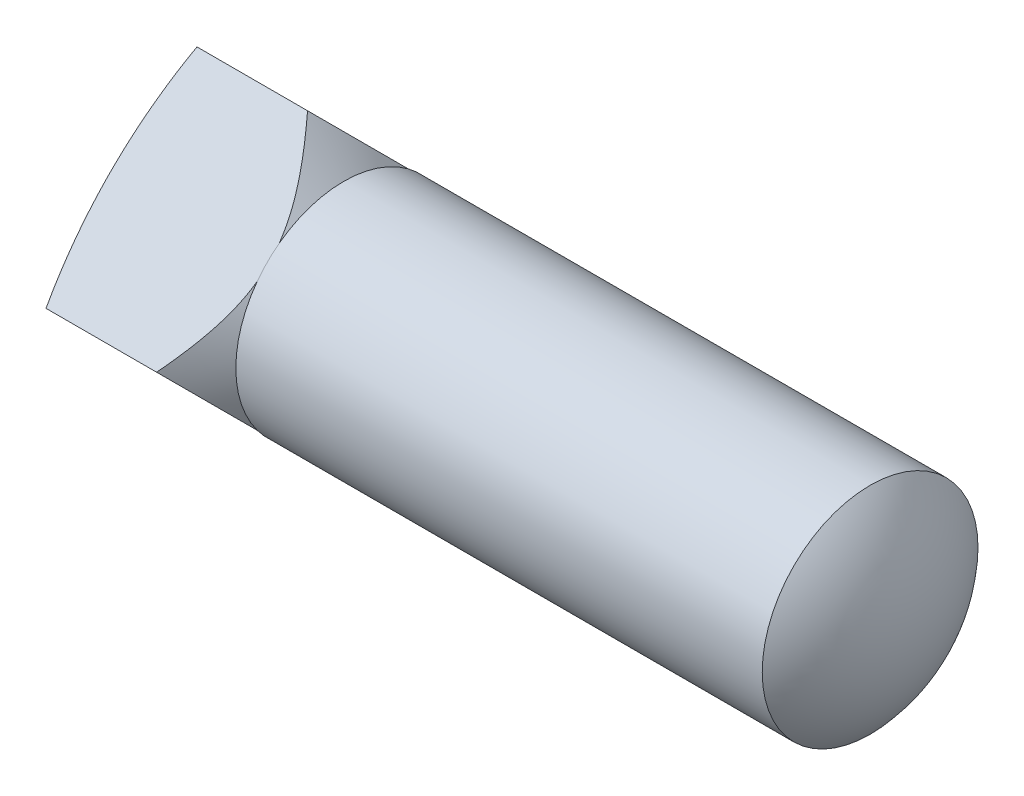
ISO-10303-21;
HEADER;
FILE_DESCRIPTION(('STEP AP214'),'2;1');
FILE_NAME('part.step','',(''),(''),'','','');
FILE_SCHEMA(('AUTOMOTIVE_DESIGN { 1 0 10303 214 1 1 1 1 }'));
ENDSEC;
DATA;
#1=APPLICATION_CONTEXT('core data for automotive mechanical design processes');
#2=APPLICATION_PROTOCOL_DEFINITION('international standard','automotive_design',2000,#1);
#3=PRODUCT_CONTEXT('',#1,'mechanical');
#4=PRODUCT('Part','Part','',(#3));
#5=PRODUCT_RELATED_PRODUCT_CATEGORY('part','',(#4));
#6=PRODUCT_DEFINITION_FORMATION('','',#4);
#7=PRODUCT_DEFINITION_CONTEXT('part definition',#1,'design');
#8=PRODUCT_DEFINITION('design','',#6,#7);
#9=PRODUCT_DEFINITION_SHAPE('','',#8);
#10=(LENGTH_UNIT() NAMED_UNIT(*) SI_UNIT(.MILLI.,.METRE.));
#11=(NAMED_UNIT(*) PLANE_ANGLE_UNIT() SI_UNIT($,.RADIAN.));
#12=(NAMED_UNIT(*) SI_UNIT($,.STERADIAN.) SOLID_ANGLE_UNIT());
#13=UNCERTAINTY_MEASURE_WITH_UNIT(LENGTH_MEASURE(1.E-05),#10,'distance_accuracy_value','');
#14=(GEOMETRIC_REPRESENTATION_CONTEXT(3) GLOBAL_UNCERTAINTY_ASSIGNED_CONTEXT((#13)) GLOBAL_UNIT_ASSIGNED_CONTEXT((#10,
#11,#12)) REPRESENTATION_CONTEXT('',''));
#15=CARTESIAN_POINT('',(0.,0.,0.));
#16=DIRECTION('',(0.,0.,1.));
#17=DIRECTION('',(1.,0.,0.));
#18=AXIS2_PLACEMENT_3D('',#15,#16,#17);
#19=CARTESIAN_POINT('',(-3.7592,0.,-3.376576301522));
#20=DIRECTION('',(0.,-0.707106781186549,0.707106781186546));
#21=DIRECTION('',(0.,-0.707106781186546,-0.707106781186549));
#22=AXIS2_PLACEMENT_3D('',#19,#20,#21);
#23=PLANE('',#22);
#24=CARTESIAN_POINT('',(-3.71463670391965,-2.84404188134766,-6.22061818286968));
#25=CARTESIAN_POINT('',(-3.55613835738031,-2.70146848632889,-6.07804478785091));
#26=CARTESIAN_POINT('',(-3.3981461725614,-2.55860959219922,-5.93518589372124));
#27=CARTESIAN_POINT('',(-3.08363247371533,-2.27203984223067,-5.64861614375269));
#28=CARTESIAN_POINT('',(-2.92711125800507,-2.12832882282157,-5.50490512434359));
#29=CARTESIAN_POINT('',(-2.61537743727245,-1.83919610910249,-5.2157724106245));
#30=CARTESIAN_POINT('',(-2.46017361078745,-1.69376967166462,-5.07034597318663));
#31=CARTESIAN_POINT('',(-2.15261018150916,-1.40143979481067,-4.77801609633269));
#32=CARTESIAN_POINT('',(-2.00025026783184,-1.25453651956937,-4.63111282109139));
#33=CARTESIAN_POINT('',(-1.72970912218957,-0.988182083810127,-4.36475838533214));
#34=CARTESIAN_POINT('',(-1.61078189630441,-0.869111186157922,-4.24568748767993));
#35=CARTESIAN_POINT('',(-1.37665028006823,-0.62910522635227,-4.00568152787428));
#36=CARTESIAN_POINT('',(-1.2614467785999,-0.508169729132244,-3.88474603065425));
#37=CARTESIAN_POINT('',(-1.03648369877529,-0.263755950580118,-3.64033225210213));
#38=CARTESIAN_POINT('',(-0.926724208648683,-0.140277628082979,-3.51685392960499));
#39=CARTESIAN_POINT('',(-0.7684117717571,0.0475823268502081,-3.3289939746718));
#40=CARTESIAN_POINT('',(-0.716703508322023,0.110632006865484,-3.26594429465652));
#41=CARTESIAN_POINT('',(-0.615958235242701,0.237786165781796,-3.13879013574021));
#42=CARTESIAN_POINT('',(-0.566920935267898,0.301890529049742,-3.07468577247226));
#43=CARTESIAN_POINT('',(-0.470564396194469,0.433616769365341,-2.94295953215667));
#44=CARTESIAN_POINT('',(-0.423365899696171,0.501283129317179,-2.87529317220483));
#45=CARTESIAN_POINT('',(-0.333664681644452,0.638144262361105,-2.7384320391609));
#46=CARTESIAN_POINT('',(-0.291160483356162,0.707338546531595,-2.66923775499041));
#47=CARTESIAN_POINT('',(-0.212295032056012,0.847303910790571,-2.52927239073143));
#48=CARTESIAN_POINT('',(-0.175920709426423,0.918071262430303,-2.4585050390917));
#49=CARTESIAN_POINT('',(-0.110910569940003,1.06137320930862,-2.31520309221338));
#50=CARTESIAN_POINT('',(-0.0822720790273512,1.13390718439999,-2.24266911712201));
#51=CARTESIAN_POINT('',(-0.0393755590361013,1.26582470943115,-2.11075159209085));
#52=CARTESIAN_POINT('',(-0.0233846612610307,1.32492428039639,-2.05165202112561));
#53=CARTESIAN_POINT('',(0.00161538214945569,1.44386018912425,-1.93271611239775));
#54=CARTESIAN_POINT('',(0.01062589901696,1.50369637983728,-1.87287992168473));
#55=CARTESIAN_POINT('',(0.0210920652181379,1.62355655088551,-1.75301975063649));
#56=CARTESIAN_POINT('',(0.0225662852538811,1.68357970456735,-1.69299659695465));
#57=CARTESIAN_POINT('',(0.0179155629650282,1.80348109631526,-1.57309520520674));
#58=CARTESIAN_POINT('',(0.0117896392073207,1.8633593146648,-1.5132169868572));
#59=CARTESIAN_POINT('',(-0.0100815229762265,1.99721927704997,-1.37935702447203));
#60=CARTESIAN_POINT('',(-0.0278264770273191,2.0710373829424,-1.30553891857961));
#61=CARTESIAN_POINT('',(-0.0730208692286259,2.21718932171447,-1.15938697980753));
#62=CARTESIAN_POINT('',(-0.100477023648008,2.28952209061008,-1.08705421091192));
#63=CARTESIAN_POINT('',(-0.147658550765414,2.39694211918634,-0.97963418233566));
#64=CARTESIAN_POINT('',(-0.16445563406514,2.43269379192944,-0.943882509592556));
#65=CARTESIAN_POINT('',(-0.199813441042721,2.50374093804668,-0.872835363475323));
#66=CARTESIAN_POINT('',(-0.218373328077732,2.53903661889179,-0.837539682630207));
#67=CARTESIAN_POINT('',(-0.257053416617413,2.60919264030522,-0.767383661216781));
#68=CARTESIAN_POINT('',(-0.277173505655789,2.64405301204261,-0.732523289479391));
#69=CARTESIAN_POINT('',(-0.31879132084626,2.71336326090943,-0.663213040612568));
#70=CARTESIAN_POINT('',(-0.340289202341565,2.74781309123004,-0.628763210291955));
#71=CARTESIAN_POINT('',(-0.403215402660207,2.84534321177681,-0.531233089745182));
#72=CARTESIAN_POINT('',(-0.446099723650983,2.90795472792716,-0.468621573594832));
#73=CARTESIAN_POINT('',(-0.535121543723193,3.03201522266659,-0.34456107885541));
#74=CARTESIAN_POINT('',(-0.581259746295166,3.09346394619475,-0.283112355327244));
#75=CARTESIAN_POINT('',(-0.723571645103508,3.27639274740933,-0.100183554112664));
#76=CARTESIAN_POINT('',(-0.823588743807215,3.39637526634609,0.0197989648240903));
#77=CARTESIAN_POINT('',(-1.03047356134524,3.63375592705894,0.257179625536947));
#78=CARTESIAN_POINT('',(-1.13735948771655,3.75114599014638,0.374569688624388));
#79=CARTESIAN_POINT('',(-1.3555789667849,3.98376603551817,0.607189733996177));
#80=CARTESIAN_POINT('',(-1.46691077768577,4.09899683825343,0.722420536731433));
#81=CARTESIAN_POINT('',(-1.69305612145303,4.32823502699326,0.951658725471272));
#82=CARTESIAN_POINT('',(-1.80787896298807,4.44223779677305,1.06566149525106));
#83=CARTESIAN_POINT('',(-2.03983717113577,4.66907271742692,1.29249641590493));
#84=CARTESIAN_POINT('',(-2.15697273510535,4.78190476713294,1.40532846561095));
#85=CARTESIAN_POINT('',(-2.39279712471293,5.00650286499344,1.62992656347145));
#86=CARTESIAN_POINT('',(-2.51148349733177,5.11827020377584,1.74169390225385));
#87=CARTESIAN_POINT('',(-2.75017246375149,5.34109999204903,1.96452369052705));
#88=CARTESIAN_POINT('',(-2.87017506440563,5.45216243786488,2.0755861363429));
#89=CARTESIAN_POINT('',(-3.05068333501773,5.61808795816654,2.24151165664455));
#90=CARTESIAN_POINT('',(-3.11080136898787,5.67316227631999,2.29658597479801));
#91=CARTESIAN_POINT('',(-3.23127854688798,5.78319708269407,2.40662078117208));
#92=CARTESIAN_POINT('',(-3.2916377379528,5.83815754511762,2.46158124359564));
#93=CARTESIAN_POINT('',(-3.41233885436045,5.94776482135316,2.57118851983118));
#94=CARTESIAN_POINT('',(-3.47268003281206,6.00241204656933,2.62583574504735));
#95=CARTESIAN_POINT('',(-3.59353260813615,6.11159399323991,2.73501769171792));
#96=CARTESIAN_POINT('',(-3.65404396700813,6.1661287357237,2.78955243420172));
#97=CARTESIAN_POINT('',(-3.71463670391965,6.22061818286967,2.84404188134768));
#98=B_SPLINE_CURVE_WITH_KNOTS('',3,(#24,#25,#26,#27,#28,#29,#30,#31,#32,#33,#34,#35,#36,#37,#38,
#39,#40,#41,#42,#43,#44,#45,#46,#47,#48,#49,#50,#51,#52,#53,#54,#55,#56,#57,#58,#59,#60,#61,#62,
#63,#64,#65,#66,#67,#68,#69,#70,#71,#72,#73,#74,#75,#76,#77,#78,#79,#80,#81,#82,#83,#84,#85,#86,
#87,#88,#89,#90,#91,#92,#93,#94,#95,#96,#97),.UNSPECIFIED.,.F.,.F.,(4,2,2,2,2,2,2,2,2,2,2,2,2,2,
2,2,2,2,2,2,2,2,2,2,2,2,2,2,2,2,2,2,2,2,2,2,4),(0.,0.769411594985046,1.53897600020602,
2.31192373762504,3.0847864790189,3.70321119591574,4.32178246157397,4.94036374898193,
5.24955145783677,5.55870549100782,5.87871228162844,6.19861811586591,6.51783299840492,
6.8369373958692,7.09196626841739,7.34694503015989,7.60129517747025,7.85567817332239,
8.17279662746613,8.49013483105983,8.64994152137469,8.80967274140047,8.9693924579743,
9.12913021439975,9.42418817492742,9.71931012383279,10.3099299987715,10.9021857726157,
11.4942117478058,12.0879855523367,12.6818102476393,13.2747881880488,13.8677692174056,
14.1629380958073,14.4581678026877,14.7523159011579,15.0464028402099),.UNSPECIFIED.);
#99=CARTESIAN_POINT('',(-0.808536519218278,0.,-3.376576301522));
#100=VERTEX_POINT('',#99);
#101=CARTESIAN_POINT('',(0.,1.44137193015166,-1.93520437137034));
#102=VERTEX_POINT('',#101);
#103=EDGE_CURVE('E153',#100,#102,#98,.T.);
#104=ORIENTED_EDGE('',*,*,#103,.F.);
#105=DIRECTION('',(1.,0.,0.));
#106=VECTOR('',#105,1.);
#107=CARTESIAN_POINT('',(-3.7592,0.,-3.376576301522));
#108=LINE('',#107,#106);
#109=CARTESIAN_POINT('',(-3.2823012150984,0.,-3.376576301522));
#110=VERTEX_POINT('',#109);
#111=EDGE_CURVE('E105',#110,#100,#108,.T.);
#112=ORIENTED_EDGE('',*,*,#111,.F.);
#113=CARTESIAN_POINT('',(8.4328,1.688288150761,-1.688288150761));
#114=DIRECTION('',(0.,-0.707106781186549,0.707106781186546));
#115=DIRECTION('',(0.,-0.707106781186546,-0.707106781186549));
#116=AXIS2_PLACEMENT_3D('',#113,#114,#115);
#117=CIRCLE('',#116,11.9559286648926);
#118=CARTESIAN_POINT('',(-3.2823012150984,3.376576301522,0.));
#119=VERTEX_POINT('',#118);
#120=EDGE_CURVE('E141',#119,#110,#117,.T.);
#121=ORIENTED_EDGE('',*,*,#120,.F.);
#122=DIRECTION('',(1.,0.,0.));
#123=VECTOR('',#122,1.);
#124=CARTESIAN_POINT('',(-3.7592,3.376576301522,0.));
#125=LINE('',#124,#123);
#126=CARTESIAN_POINT('',(-0.808536519218278,3.376576301522,0.));
#127=VERTEX_POINT('',#126);
#128=EDGE_CURVE('E139',#119,#127,#125,.T.);
#129=ORIENTED_EDGE('',*,*,#128,.T.);
#130=CARTESIAN_POINT('',(0.,1.93520437137034,-1.44137193015166));
#131=VERTEX_POINT('',#130);
#132=EDGE_CURVE('E163',#131,#127,#98,.T.);
#133=ORIENTED_EDGE('',*,*,#132,.F.);
#134=DIRECTION('',(0.,-0.707106781186546,-0.707106781186549));
#135=VECTOR('',#134,1.);
#136=CARTESIAN_POINT('',(0.,0.,-3.376576301522));
#137=LINE('',#136,#135);
#138=EDGE_CURVE('E40',#131,#102,#137,.T.);
#139=ORIENTED_EDGE('',*,*,#138,.T.);
#140=EDGE_LOOP('',(#104,#112,#121,#129,#133,#139));
#141=FACE_BOUND('',#140,.T.);
#142=ADVANCED_FACE('F32',(#141),#23,.F.);
#143=CARTESIAN_POINT('',(-3.7592,0.,-3.376576301522));
#144=DIRECTION('',(0.,0.707106781186546,0.707106781186549));
#145=DIRECTION('',(0.,-0.707106781186549,0.707106781186546));
#146=AXIS2_PLACEMENT_3D('',#143,#144,#145);
#147=PLANE('',#146);
#148=CARTESIAN_POINT('',(-3.71463670391965,-6.22061818286968,2.84404188134766));
#149=CARTESIAN_POINT('',(-3.55613835738031,-6.07804478785091,2.70146848632889));
#150=CARTESIAN_POINT('',(-3.3981461725614,-5.93518589372124,2.55860959219922));
#151=CARTESIAN_POINT('',(-3.08363247371533,-5.64861614375269,2.27203984223067));
#152=CARTESIAN_POINT('',(-2.92711125800507,-5.50490512434359,2.12832882282157));
#153=CARTESIAN_POINT('',(-2.61537743727245,-5.2157724106245,1.83919610910249));
#154=CARTESIAN_POINT('',(-2.46017361078745,-5.07034597318663,1.69376967166462));
#155=CARTESIAN_POINT('',(-2.15261018150916,-4.77801609633269,1.40143979481067));
#156=CARTESIAN_POINT('',(-2.00025026783184,-4.63111282109139,1.25453651956937));
#157=CARTESIAN_POINT('',(-1.72970912218957,-4.36475838533214,0.988182083810127));
#158=CARTESIAN_POINT('',(-1.61078189630441,-4.24568748767993,0.869111186157922));
#159=CARTESIAN_POINT('',(-1.37665028006823,-4.00568152787428,0.629105226352271));
#160=CARTESIAN_POINT('',(-1.2614467785999,-3.88474603065425,0.508169729132244));
#161=CARTESIAN_POINT('',(-1.03648369877529,-3.64033225210213,0.263755950580118));
#162=CARTESIAN_POINT('',(-0.926724208648684,-3.51685392960499,0.14027762808298));
#163=CARTESIAN_POINT('',(-0.768411771757102,-3.3289939746718,-0.0475823268502078));
#164=CARTESIAN_POINT('',(-0.716703508322024,-3.26594429465652,-0.110632006865485));
#165=CARTESIAN_POINT('',(-0.615958235242702,-3.13879013574021,-0.237786165781796));
#166=CARTESIAN_POINT('',(-0.566920935267899,-3.07468577247227,-0.301890529049741));
#167=CARTESIAN_POINT('',(-0.470564396194469,-2.94295953215667,-0.43361676936534));
#168=CARTESIAN_POINT('',(-0.423365899696171,-2.87529317220483,-0.501283129317179));
#169=CARTESIAN_POINT('',(-0.333664681644453,-2.7384320391609,-0.638144262361105));
#170=CARTESIAN_POINT('',(-0.291160483356162,-2.66923775499041,-0.707338546531596));
#171=CARTESIAN_POINT('',(-0.212295032056012,-2.52927239073143,-0.847303910790571));
#172=CARTESIAN_POINT('',(-0.175920709426423,-2.4585050390917,-0.918071262430302));
#173=CARTESIAN_POINT('',(-0.110910569940003,-2.31520309221338,-1.06137320930862));
#174=CARTESIAN_POINT('',(-0.0822720790273521,-2.24266911712201,-1.13390718439999));
#175=CARTESIAN_POINT('',(-0.0393755590361021,-2.11075159209085,-1.26582470943115));
#176=CARTESIAN_POINT('',(-0.0233846612610312,-2.05165202112561,-1.32492428039639));
#177=CARTESIAN_POINT('',(0.00161538214945543,-1.93271611239775,-1.44386018912425));
#178=CARTESIAN_POINT('',(0.0106258990169597,-1.87287992168473,-1.50369637983728));
#179=CARTESIAN_POINT('',(0.0210920652181375,-1.75301975063649,-1.62355655088551));
#180=CARTESIAN_POINT('',(0.0225662852538807,-1.69299659695465,-1.68357970456735));
#181=CARTESIAN_POINT('',(0.0179155629650279,-1.57309520520674,-1.80348109631526));
#182=CARTESIAN_POINT('',(0.0117896392073206,-1.5132169868572,-1.8633593146648));
#183=CARTESIAN_POINT('',(-0.0100815229762264,-1.37935702447203,-1.99721927704997));
#184=CARTESIAN_POINT('',(-0.0278264770273189,-1.30553891857961,-2.0710373829424));
#185=CARTESIAN_POINT('',(-0.0730208692286258,-1.15938697980753,-2.21718932171447));
#186=CARTESIAN_POINT('',(-0.100477023648008,-1.08705421091192,-2.28952209061008));
#187=CARTESIAN_POINT('',(-0.147658550765414,-0.979634182335661,-2.39694211918634));
#188=CARTESIAN_POINT('',(-0.16445563406514,-0.943882509592557,-2.43269379192944));
#189=CARTESIAN_POINT('',(-0.199813441042721,-0.872835363475324,-2.50374093804668));
#190=CARTESIAN_POINT('',(-0.218373328077731,-0.837539682630207,-2.53903661889179));
#191=CARTESIAN_POINT('',(-0.257053416617413,-0.76738366121678,-2.60919264030522));
#192=CARTESIAN_POINT('',(-0.277173505655789,-0.732523289479391,-2.64405301204261));
#193=CARTESIAN_POINT('',(-0.31879132084626,-0.663213040612568,-2.71336326090943));
#194=CARTESIAN_POINT('',(-0.340289202341565,-0.628763210291955,-2.74781309123004));
#195=CARTESIAN_POINT('',(-0.403215402660207,-0.531233089745183,-2.84534321177681));
#196=CARTESIAN_POINT('',(-0.446099723650983,-0.468621573594833,-2.90795472792716));
#197=CARTESIAN_POINT('',(-0.535121543723192,-0.34456107885541,-3.03201522266659));
#198=CARTESIAN_POINT('',(-0.581259746295166,-0.283112355327245,-3.09346394619475));
#199=CARTESIAN_POINT('',(-0.723571645103507,-0.100183554112666,-3.27639274740933));
#200=CARTESIAN_POINT('',(-0.823588743807214,0.0197989648240894,-3.39637526634609));
#201=CARTESIAN_POINT('',(-1.03047356134524,0.257179625536946,-3.63375592705894));
#202=CARTESIAN_POINT('',(-1.13735948771655,0.374569688624386,-3.75114599014638));
#203=CARTESIAN_POINT('',(-1.3555789667849,0.607189733996175,-3.98376603551817));
#204=CARTESIAN_POINT('',(-1.46691077768577,0.722420536731431,-4.09899683825342));
#205=CARTESIAN_POINT('',(-1.69305612145303,0.95165872547127,-4.32823502699326));
#206=CARTESIAN_POINT('',(-1.80787896298807,1.06566149525105,-4.44223779677305));
#207=CARTESIAN_POINT('',(-2.03983717113577,1.29249641590493,-4.66907271742692));
#208=CARTESIAN_POINT('',(-2.15697273510535,1.40532846561095,-4.78190476713294));
#209=CARTESIAN_POINT('',(-2.39279712471293,1.62992656347145,-5.00650286499344));
#210=CARTESIAN_POINT('',(-2.51148349733177,1.74169390225385,-5.11827020377584));
#211=CARTESIAN_POINT('',(-2.75017246375149,1.96452369052704,-5.34109999204903));
#212=CARTESIAN_POINT('',(-2.87017506440563,2.07558613634289,-5.45216243786488));
#213=CARTESIAN_POINT('',(-3.05068333501773,2.24151165664455,-5.61808795816653));
#214=CARTESIAN_POINT('',(-3.11080136898787,2.29658597479801,-5.67316227631999));
#215=CARTESIAN_POINT('',(-3.23127854688798,2.40662078117208,-5.78319708269407));
#216=CARTESIAN_POINT('',(-3.2916377379528,2.46158124359564,-5.83815754511762));
#217=CARTESIAN_POINT('',(-3.41233885436045,2.57118851983118,-5.94776482135316));
#218=CARTESIAN_POINT('',(-3.47268003281206,2.62583574504735,-6.00241204656933));
#219=CARTESIAN_POINT('',(-3.59353260813615,2.73501769171792,-6.11159399323991));
#220=CARTESIAN_POINT('',(-3.65404396700813,2.78955243420172,-6.1661287357237));
#221=CARTESIAN_POINT('',(-3.71463670391965,2.84404188134768,-6.22061818286967));
#222=B_SPLINE_CURVE_WITH_KNOTS('',3,(#148,#149,#150,#151,#152,#153,#154,#155,#156,#157,#158,
#159,#160,#161,#162,#163,#164,#165,#166,#167,#168,#169,#170,#171,#172,#173,#174,#175,#176,#177,
#178,#179,#180,#181,#182,#183,#184,#185,#186,#187,#188,#189,#190,#191,#192,#193,#194,#195,#196,
#197,#198,#199,#200,#201,#202,#203,#204,#205,#206,#207,#208,#209,#210,#211,#212,#213,#214,#215,
#216,#217,#218,#219,#220,#221),.UNSPECIFIED.,.F.,.F.,(4,2,2,2,2,2,2,2,2,2,2,2,2,2,2,2,2,2,2,2,2,
2,2,2,2,2,2,2,2,2,2,2,2,2,2,2,4),(0.,0.769411594985046,1.53897600020603,2.31192373762504,
3.0847864790189,3.70321119591574,4.32178246157397,4.94036374898192,5.24955145783677,
5.55870549100782,5.87871228162844,6.19861811586591,6.51783299840492,6.8369373958692,
7.09196626841739,7.34694503015989,7.60129517747025,7.85567817332239,8.17279662746613,
8.49013483105983,8.64994152137469,8.80967274140047,8.9693924579743,9.12913021439976,
9.42418817492742,9.71931012383279,10.3099299987715,10.9021857726157,11.4942117478058,
12.0879855523367,12.6818102476393,13.2747881880488,13.8677692174056,14.1629380958073,
14.4581678026877,14.7523159011579,15.0464028402099),.UNSPECIFIED.);
#223=CARTESIAN_POINT('',(-0.808536519218278,-3.376576301522,0.));
#224=VERTEX_POINT('',#223);
#225=CARTESIAN_POINT('',(0.,-1.93520437137034,-1.44137193015166));
#226=VERTEX_POINT('',#225);
#227=EDGE_CURVE('E154',#224,#226,#222,.T.);
#228=ORIENTED_EDGE('',*,*,#227,.F.);
#229=DIRECTION('',(1.,0.,0.));
#230=VECTOR('',#229,1.);
#231=CARTESIAN_POINT('',(-3.7592,-3.376576301522,0.));
#232=LINE('',#231,#230);
#233=CARTESIAN_POINT('',(-3.2823012150984,-3.376576301522,0.));
#234=VERTEX_POINT('',#233);
#235=EDGE_CURVE('E135',#234,#224,#232,.T.);
#236=ORIENTED_EDGE('',*,*,#235,.F.);
#237=CARTESIAN_POINT('',(8.4328,-1.688288150761,-1.688288150761));
#238=DIRECTION('',(0.,0.707106781186546,0.707106781186549));
#239=DIRECTION('',(0.,-0.707106781186549,0.707106781186546));
#240=AXIS2_PLACEMENT_3D('',#237,#238,#239);
#241=CIRCLE('',#240,11.9559286648926);
#242=EDGE_CURVE('E150',#110,#234,#241,.T.);
#243=ORIENTED_EDGE('',*,*,#242,.F.);
#244=ORIENTED_EDGE('',*,*,#111,.T.);
#245=CARTESIAN_POINT('',(0.,-1.44137193015166,-1.93520437137034));
#246=VERTEX_POINT('',#245);
#247=EDGE_CURVE('E161',#246,#100,#222,.T.);
#248=ORIENTED_EDGE('',*,*,#247,.F.);
#249=DIRECTION('',(0.,-0.707106781186549,0.707106781186546));
#250=VECTOR('',#249,1.);
#251=CARTESIAN_POINT('',(0.,0.,-3.376576301522));
#252=LINE('',#251,#250);
#253=EDGE_CURVE('E130',#246,#226,#252,.T.);
#254=ORIENTED_EDGE('',*,*,#253,.T.);
#255=EDGE_LOOP('',(#228,#236,#243,#244,#248,#254));
#256=FACE_BOUND('',#255,.T.);
#257=ADVANCED_FACE('F169',(#256),#147,.F.);
#258=CARTESIAN_POINT('',(-3.7592,-3.376576301522,0.));
#259=DIRECTION('',(0.,0.707106781186549,-0.707106781186546));
#260=DIRECTION('',(0.,0.707106781186546,0.707106781186549));
#261=AXIS2_PLACEMENT_3D('',#258,#259,#260);
#262=PLANE('',#261);
#263=CARTESIAN_POINT('',(-3.71463670391965,2.84404188134766,6.22061818286968));
#264=CARTESIAN_POINT('',(-3.55613835738031,2.70146848632889,6.07804478785091));
#265=CARTESIAN_POINT('',(-3.3981461725614,2.55860959219922,5.93518589372124));
#266=CARTESIAN_POINT('',(-3.08363247371533,2.27203984223067,5.64861614375269));
#267=CARTESIAN_POINT('',(-2.92711125800507,2.12832882282157,5.50490512434359));
#268=CARTESIAN_POINT('',(-2.61537743727245,1.83919610910249,5.2157724106245));
#269=CARTESIAN_POINT('',(-2.46017361078745,1.69376967166462,5.07034597318663));
#270=CARTESIAN_POINT('',(-2.15261018150916,1.40143979481067,4.77801609633269));
#271=CARTESIAN_POINT('',(-2.00025026783184,1.25453651956937,4.63111282109139));
#272=CARTESIAN_POINT('',(-1.72970912218957,0.988182083810127,4.36475838533214));
#273=CARTESIAN_POINT('',(-1.61078189630441,0.869111186157923,4.24568748767993));
#274=CARTESIAN_POINT('',(-1.37665028006823,0.629105226352271,4.00568152787428));
#275=CARTESIAN_POINT('',(-1.2614467785999,0.508169729132245,3.88474603065425));
#276=CARTESIAN_POINT('',(-1.03648369877529,0.263755950580118,3.64033225210213));
#277=CARTESIAN_POINT('',(-0.926724208648684,0.14027762808298,3.51685392960499));
#278=CARTESIAN_POINT('',(-0.768411771757101,-0.0475823268502077,3.3289939746718));
#279=CARTESIAN_POINT('',(-0.716703508322023,-0.110632006865484,3.26594429465652));
#280=CARTESIAN_POINT('',(-0.615958235242701,-0.237786165781796,3.13879013574021));
#281=CARTESIAN_POINT('',(-0.566920935267899,-0.301890529049741,3.07468577247227));
#282=CARTESIAN_POINT('',(-0.470564396194469,-0.43361676936534,2.94295953215667));
#283=CARTESIAN_POINT('',(-0.423365899696171,-0.501283129317179,2.87529317220483));
#284=CARTESIAN_POINT('',(-0.333664681644453,-0.638144262361105,2.7384320391609));
#285=CARTESIAN_POINT('',(-0.291160483356162,-0.707338546531595,2.66923775499041));
#286=CARTESIAN_POINT('',(-0.212295032056012,-0.84730391079057,2.52927239073143));
#287=CARTESIAN_POINT('',(-0.175920709426424,-0.918071262430302,2.4585050390917));
#288=CARTESIAN_POINT('',(-0.110910569940003,-1.06137320930862,2.31520309221338));
#289=CARTESIAN_POINT('',(-0.0822720790273513,-1.13390718439999,2.24266911712201));
#290=CARTESIAN_POINT('',(-0.0393755590361015,-1.26582470943115,2.11075159209085));
#291=CARTESIAN_POINT('',(-0.0233846612610312,-1.32492428039639,2.05165202112561));
#292=CARTESIAN_POINT('',(0.00161538214945522,-1.44386018912425,1.93271611239775));
#293=CARTESIAN_POINT('',(0.0106258990169598,-1.50369637983728,1.87287992168473));
#294=CARTESIAN_POINT('',(0.0210920652181375,-1.62355655088551,1.75301975063649));
#295=CARTESIAN_POINT('',(0.0225662852538803,-1.68357970456735,1.69299659695465));
#296=CARTESIAN_POINT('',(0.0179155629650275,-1.80348109631526,1.57309520520674));
#297=CARTESIAN_POINT('',(0.0117896392073205,-1.8633593146648,1.5132169868572));
#298=CARTESIAN_POINT('',(-0.0100815229762263,-1.99721927704997,1.37935702447203));
#299=CARTESIAN_POINT('',(-0.027826477027319,-2.0710373829424,1.30553891857961));
#300=CARTESIAN_POINT('',(-0.0730208692286261,-2.21718932171447,1.15938697980753));
#301=CARTESIAN_POINT('',(-0.100477023648008,-2.28952209061008,1.08705421091192));
#302=CARTESIAN_POINT('',(-0.147658550765414,-2.39694211918634,0.97963418233566));
#303=CARTESIAN_POINT('',(-0.16445563406514,-2.43269379192944,0.943882509592556));
#304=CARTESIAN_POINT('',(-0.199813441042722,-2.50374093804668,0.872835363475323));
#305=CARTESIAN_POINT('',(-0.218373328077732,-2.53903661889179,0.837539682630206));
#306=CARTESIAN_POINT('',(-0.257053416617413,-2.60919264030522,0.767383661216781));
#307=CARTESIAN_POINT('',(-0.277173505655789,-2.64405301204261,0.732523289479391));
#308=CARTESIAN_POINT('',(-0.31879132084626,-2.71336326090943,0.663213040612568));
#309=CARTESIAN_POINT('',(-0.340289202341565,-2.74781309123004,0.628763210291955));
#310=CARTESIAN_POINT('',(-0.403215402660207,-2.84534321177681,0.531233089745183));
#311=CARTESIAN_POINT('',(-0.446099723650983,-2.90795472792716,0.468621573594833));
#312=CARTESIAN_POINT('',(-0.535121543723192,-3.03201522266659,0.34456107885541));
#313=CARTESIAN_POINT('',(-0.581259746295166,-3.09346394619475,0.283112355327245));
#314=CARTESIAN_POINT('',(-0.723571645103507,-3.27639274740933,0.100183554112665));
#315=CARTESIAN_POINT('',(-0.823588743807214,-3.39637526634609,-0.0197989648240894));
#316=CARTESIAN_POINT('',(-1.03047356134524,-3.63375592705894,-0.257179625536946));
#317=CARTESIAN_POINT('',(-1.13735948771655,-3.75114599014638,-0.374569688624387));
#318=CARTESIAN_POINT('',(-1.3555789667849,-3.98376603551817,-0.607189733996175));
#319=CARTESIAN_POINT('',(-1.46691077768577,-4.09899683825342,-0.722420536731431));
#320=CARTESIAN_POINT('',(-1.69305612145303,-4.32823502699326,-0.95165872547127));
#321=CARTESIAN_POINT('',(-1.80787896298807,-4.44223779677305,-1.06566149525105));
#322=CARTESIAN_POINT('',(-2.03983717113577,-4.66907271742692,-1.29249641590493));
#323=CARTESIAN_POINT('',(-2.15697273510535,-4.78190476713294,-1.40532846561095));
#324=CARTESIAN_POINT('',(-2.39279712471293,-5.00650286499344,-1.62992656347145));
#325=CARTESIAN_POINT('',(-2.51148349733177,-5.11827020377584,-1.74169390225385));
#326=CARTESIAN_POINT('',(-2.75017246375149,-5.34109999204903,-1.96452369052704));
#327=CARTESIAN_POINT('',(-2.87017506440563,-5.45216243786488,-2.07558613634289));
#328=CARTESIAN_POINT('',(-3.05068333501773,-5.61808795816653,-2.24151165664455));
#329=CARTESIAN_POINT('',(-3.11080136898787,-5.67316227631999,-2.296585974798));
#330=CARTESIAN_POINT('',(-3.23127854688798,-5.78319708269407,-2.40662078117208));
#331=CARTESIAN_POINT('',(-3.29163773795279,-5.83815754511762,-2.46158124359564));
#332=CARTESIAN_POINT('',(-3.41233885436045,-5.94776482135316,-2.57118851983118));
#333=CARTESIAN_POINT('',(-3.47268003281206,-6.00241204656933,-2.62583574504735));
#334=CARTESIAN_POINT('',(-3.59353260813615,-6.11159399323991,-2.73501769171792));
#335=CARTESIAN_POINT('',(-3.65404396700813,-6.1661287357237,-2.78955243420172));
#336=CARTESIAN_POINT('',(-3.71463670391965,-6.22061818286967,-2.84404188134768));
#337=B_SPLINE_CURVE_WITH_KNOTS('',3,(#263,#264,#265,#266,#267,#268,#269,#270,#271,#272,#273,
#274,#275,#276,#277,#278,#279,#280,#281,#282,#283,#284,#285,#286,#287,#288,#289,#290,#291,#292,
#293,#294,#295,#296,#297,#298,#299,#300,#301,#302,#303,#304,#305,#306,#307,#308,#309,#310,#311,
#312,#313,#314,#315,#316,#317,#318,#319,#320,#321,#322,#323,#324,#325,#326,#327,#328,#329,#330,
#331,#332,#333,#334,#335,#336),.UNSPECIFIED.,.F.,.F.,(4,2,2,2,2,2,2,2,2,2,2,2,2,2,2,2,2,2,2,2,2,
2,2,2,2,2,2,2,2,2,2,2,2,2,2,2,4),(0.,0.769411594985046,1.53897600020603,2.31192373762504,
3.0847864790189,3.70321119591574,4.32178246157397,4.94036374898192,5.24955145783677,
5.55870549100782,5.87871228162844,6.19861811586591,6.51783299840492,6.8369373958692,
7.09196626841739,7.34694503015989,7.60129517747024,7.85567817332239,8.17279662746613,
8.49013483105983,8.64994152137469,8.80967274140047,8.9693924579743,9.12913021439975,
9.42418817492741,9.71931012383279,10.3099299987715,10.9021857726157,11.4942117478058,
12.0879855523367,12.6818102476393,13.2747881880488,13.8677692174056,14.1629380958073,
14.4581678026877,14.7523159011579,15.0464028402099),.UNSPECIFIED.);
#338=CARTESIAN_POINT('',(-0.808536519218278,0.,3.376576301522));
#339=VERTEX_POINT('',#338);
#340=CARTESIAN_POINT('',(0.,-1.44137193015166,1.93520437137034));
#341=VERTEX_POINT('',#340);
#342=EDGE_CURVE('E54',#339,#341,#337,.T.);
#343=ORIENTED_EDGE('',*,*,#342,.F.);
#344=DIRECTION('',(1.,0.,0.));
#345=VECTOR('',#344,1.);
#346=CARTESIAN_POINT('',(-3.7592,0.,3.376576301522));
#347=LINE('',#346,#345);
#348=CARTESIAN_POINT('',(-3.2823012150984,0.,3.376576301522));
#349=VERTEX_POINT('',#348);
#350=EDGE_CURVE('E116',#349,#339,#347,.T.);
#351=ORIENTED_EDGE('',*,*,#350,.F.);
#352=CARTESIAN_POINT('',(8.4328,-1.688288150761,1.688288150761));
#353=DIRECTION('',(0.,0.707106781186549,-0.707106781186546));
#354=DIRECTION('',(0.,0.707106781186546,0.707106781186549));
#355=AXIS2_PLACEMENT_3D('',#352,#353,#354);
#356=CIRCLE('',#355,11.9559286648926);
#357=EDGE_CURVE('E46',#234,#349,#356,.T.);
#358=ORIENTED_EDGE('',*,*,#357,.F.);
#359=ORIENTED_EDGE('',*,*,#235,.T.);
#360=CARTESIAN_POINT('',(0.,-1.93520437137034,1.44137193015166));
#361=VERTEX_POINT('',#360);
#362=EDGE_CURVE('E162',#361,#224,#337,.T.);
#363=ORIENTED_EDGE('',*,*,#362,.F.);
#364=DIRECTION('',(0.,0.707106781186546,0.707106781186549));
#365=VECTOR('',#364,1.);
#366=CARTESIAN_POINT('',(0.,-3.376576301522,0.));
#367=LINE('',#366,#365);
#368=EDGE_CURVE('E122',#361,#341,#367,.T.);
#369=ORIENTED_EDGE('',*,*,#368,.T.);
#370=EDGE_LOOP('',(#343,#351,#358,#359,#363,#369));
#371=FACE_BOUND('',#370,.T.);
#372=ADVANCED_FACE('F190',(#371),#262,.F.);
#373=CARTESIAN_POINT('',(-3.7592,3.376576301522,0.));
#374=DIRECTION('',(0.,-0.707106781186546,-0.707106781186549));
#375=DIRECTION('',(0.,0.707106781186549,-0.707106781186546));
#376=AXIS2_PLACEMENT_3D('',#373,#374,#375);
#377=PLANE('',#376);
#378=CARTESIAN_POINT('',(-3.71463670391965,6.22061818286968,-2.84404188134766));
#379=CARTESIAN_POINT('',(-3.55613835738031,6.07804478785091,-2.70146848632889));
#380=CARTESIAN_POINT('',(-3.3981461725614,5.93518589372124,-2.55860959219922));
#381=CARTESIAN_POINT('',(-3.08363247371533,5.64861614375269,-2.27203984223067));
#382=CARTESIAN_POINT('',(-2.92711125800507,5.50490512434359,-2.12832882282157));
#383=CARTESIAN_POINT('',(-2.61537743727245,5.2157724106245,-1.83919610910249));
#384=CARTESIAN_POINT('',(-2.46017361078745,5.07034597318663,-1.69376967166462));
#385=CARTESIAN_POINT('',(-2.15261018150916,4.77801609633269,-1.40143979481067));
#386=CARTESIAN_POINT('',(-2.00025026783184,4.63111282109139,-1.25453651956937));
#387=CARTESIAN_POINT('',(-1.72970912218957,4.36475838533214,-0.988182083810126));
#388=CARTESIAN_POINT('',(-1.61078189630441,4.24568748767993,-0.869111186157922));
#389=CARTESIAN_POINT('',(-1.37665028006823,4.00568152787428,-0.62910522635227));
#390=CARTESIAN_POINT('',(-1.2614467785999,3.88474603065425,-0.508169729132244));
#391=CARTESIAN_POINT('',(-1.03648369877529,3.64033225210213,-0.263755950580118));
#392=CARTESIAN_POINT('',(-0.926724208648683,3.51685392960499,-0.14027762808298));
#393=CARTESIAN_POINT('',(-0.7684117717571,3.3289939746718,0.0475823268502082));
#394=CARTESIAN_POINT('',(-0.716703508322023,3.26594429465652,0.110632006865485));
#395=CARTESIAN_POINT('',(-0.615958235242701,3.13879013574021,0.237786165781797));
#396=CARTESIAN_POINT('',(-0.566920935267897,3.07468577247226,0.301890529049742));
#397=CARTESIAN_POINT('',(-0.470564396194468,2.94295953215666,0.433616769365342));
#398=CARTESIAN_POINT('',(-0.42336589969617,2.87529317220483,0.50128312931718));
#399=CARTESIAN_POINT('',(-0.333664681644452,2.7384320391609,0.638144262361106));
#400=CARTESIAN_POINT('',(-0.291160483356161,2.66923775499041,0.707338546531596));
#401=CARTESIAN_POINT('',(-0.212295032056012,2.52927239073143,0.847303910790571));
#402=CARTESIAN_POINT('',(-0.175920709426423,2.4585050390917,0.918071262430303));
#403=CARTESIAN_POINT('',(-0.110910569940003,2.31520309221338,1.06137320930862));
#404=CARTESIAN_POINT('',(-0.0822720790273508,2.24266911712201,1.13390718439999));
#405=CARTESIAN_POINT('',(-0.0393755590361008,2.11075159209085,1.26582470943115));
#406=CARTESIAN_POINT('',(-0.0233846612610303,2.05165202112561,1.3249242803964));
#407=CARTESIAN_POINT('',(0.00161538214945619,1.93271611239775,1.44386018912425));
#408=CARTESIAN_POINT('',(0.0106258990169606,1.87287992168472,1.50369637983728));
#409=CARTESIAN_POINT('',(0.0210920652181382,1.75301975063649,1.62355655088551));
#410=CARTESIAN_POINT('',(0.0225662852538811,1.69299659695465,1.68357970456735));
#411=CARTESIAN_POINT('',(0.0179155629650281,1.57309520520674,1.80348109631526));
#412=CARTESIAN_POINT('',(0.0117896392073209,1.5132169868572,1.8633593146648));
#413=CARTESIAN_POINT('',(-0.0100815229762263,1.37935702447203,1.99721927704997));
#414=CARTESIAN_POINT('',(-0.0278264770273194,1.3055389185796,2.0710373829424));
#415=CARTESIAN_POINT('',(-0.0730208692286265,1.15938697980753,2.21718932171447));
#416=CARTESIAN_POINT('',(-0.100477023648008,1.08705421091191,2.28952209061009));
#417=CARTESIAN_POINT('',(-0.147658550765415,0.979634182335658,2.39694211918634));
#418=CARTESIAN_POINT('',(-0.164455634065141,0.943882509592554,2.43269379192944));
#419=CARTESIAN_POINT('',(-0.199813441042723,0.872835363475321,2.50374093804668));
#420=CARTESIAN_POINT('',(-0.218373328077733,0.837539682630204,2.53903661889179));
#421=CARTESIAN_POINT('',(-0.257053416617414,0.767383661216778,2.60919264030522));
#422=CARTESIAN_POINT('',(-0.27717350565579,0.732523289479389,2.64405301204261));
#423=CARTESIAN_POINT('',(-0.318791320846261,0.663213040612566,2.71336326090943));
#424=CARTESIAN_POINT('',(-0.340289202341565,0.628763210291953,2.74781309123004));
#425=CARTESIAN_POINT('',(-0.403215402660208,0.531233089745182,2.84534321177682));
#426=CARTESIAN_POINT('',(-0.446099723650983,0.468621573594832,2.90795472792716));
#427=CARTESIAN_POINT('',(-0.535121543723193,0.344561078855409,3.03201522266659));
#428=CARTESIAN_POINT('',(-0.581259746295167,0.283112355327243,3.09346394619475));
#429=CARTESIAN_POINT('',(-0.723571645103508,0.100183554112663,3.27639274740933));
#430=CARTESIAN_POINT('',(-0.823588743807216,-0.0197989648240921,3.39637526634609));
#431=CARTESIAN_POINT('',(-1.03047356134524,-0.257179625536949,3.63375592705894));
#432=CARTESIAN_POINT('',(-1.13735948771656,-0.37456968862439,3.75114599014638));
#433=CARTESIAN_POINT('',(-1.3555789667849,-0.607189733996178,3.98376603551817));
#434=CARTESIAN_POINT('',(-1.46691077768577,-0.722420536731434,4.09899683825343));
#435=CARTESIAN_POINT('',(-1.69305612145304,-0.951658725471274,4.32823502699327));
#436=CARTESIAN_POINT('',(-1.80787896298807,-1.06566149525106,4.44223779677305));
#437=CARTESIAN_POINT('',(-2.03983717113577,-1.29249641590493,4.66907271742692));
#438=CARTESIAN_POINT('',(-2.15697273510536,-1.40532846561095,4.78190476713294));
#439=CARTESIAN_POINT('',(-2.39279712471293,-1.62992656347146,5.00650286499345));
#440=CARTESIAN_POINT('',(-2.51148349733177,-1.74169390225385,5.11827020377584));
#441=CARTESIAN_POINT('',(-2.7501724637515,-1.96452369052705,5.34109999204904));
#442=CARTESIAN_POINT('',(-2.87017506440564,-2.0755861363429,5.45216243786489));
#443=CARTESIAN_POINT('',(-3.05068333501774,-2.24151165664455,5.61808795816654));
#444=CARTESIAN_POINT('',(-3.11080136898788,-2.29658597479801,5.67316227632));
#445=CARTESIAN_POINT('',(-3.23127854688799,-2.40662078117208,5.78319708269407));
#446=CARTESIAN_POINT('',(-3.2916377379528,-2.46158124359564,5.83815754511763));
#447=CARTESIAN_POINT('',(-3.41233885436046,-2.57118851983118,5.94776482135317));
#448=CARTESIAN_POINT('',(-3.47268003281206,-2.62583574504735,6.00241204656933));
#449=CARTESIAN_POINT('',(-3.59353260813615,-2.73501769171792,6.11159399323991));
#450=CARTESIAN_POINT('',(-3.65404396700814,-2.78955243420172,6.1661287357237));
#451=CARTESIAN_POINT('',(-3.71463670391965,-2.84404188134768,6.22061818286967));
#452=B_SPLINE_CURVE_WITH_KNOTS('',3,(#378,#379,#380,#381,#382,#383,#384,#385,#386,#387,#388,
#389,#390,#391,#392,#393,#394,#395,#396,#397,#398,#399,#400,#401,#402,#403,#404,#405,#406,#407,
#408,#409,#410,#411,#412,#413,#414,#415,#416,#417,#418,#419,#420,#421,#422,#423,#424,#425,#426,
#427,#428,#429,#430,#431,#432,#433,#434,#435,#436,#437,#438,#439,#440,#441,#442,#443,#444,#445,
#446,#447,#448,#449,#450,#451),.UNSPECIFIED.,.F.,.F.,(4,2,2,2,2,2,2,2,2,2,2,2,2,2,2,2,2,2,2,2,2,
2,2,2,2,2,2,2,2,2,2,2,2,2,2,2,4),(0.,0.769411594985046,1.53897600020603,2.31192373762504,
3.0847864790189,3.70321119591574,4.32178246157397,4.94036374898193,5.24955145783677,
5.55870549100782,5.87871228162844,6.19861811586592,6.51783299840492,6.8369373958692,
7.09196626841739,7.34694503015989,7.60129517747025,7.85567817332239,8.17279662746613,
8.49013483105983,8.6499415213747,8.80967274140047,8.96939245797431,9.12913021439976,
9.42418817492742,9.7193101238328,10.3099299987715,10.9021857726157,11.4942117478058,
12.0879855523367,12.6818102476393,13.2747881880488,13.8677692174057,14.1629380958073,
14.4581678026877,14.7523159011579,15.0464028402099),.UNSPECIFIED.);
#453=CARTESIAN_POINT('',(0.,1.93520437137034,1.44137193015166));
#454=VERTEX_POINT('',#453);
#455=EDGE_CURVE('E118',#127,#454,#452,.T.);
#456=ORIENTED_EDGE('',*,*,#455,.F.);
#457=ORIENTED_EDGE('',*,*,#128,.F.);
#458=CARTESIAN_POINT('',(8.4328,1.688288150761,1.688288150761));
#459=DIRECTION('',(0.,-0.707106781186546,-0.707106781186549));
#460=DIRECTION('',(0.,0.707106781186549,-0.707106781186546));
#461=AXIS2_PLACEMENT_3D('',#458,#459,#460);
#462=CIRCLE('',#461,11.9559286648926);
#463=EDGE_CURVE('E11',#349,#119,#462,.T.);
#464=ORIENTED_EDGE('',*,*,#463,.F.);
#465=ORIENTED_EDGE('',*,*,#350,.T.);
#466=CARTESIAN_POINT('',(0.,1.44137193015166,1.93520437137034));
#467=VERTEX_POINT('',#466);
#468=EDGE_CURVE('E99',#467,#339,#452,.T.);
#469=ORIENTED_EDGE('',*,*,#468,.F.);
#470=DIRECTION('',(0.,0.707106781186549,-0.707106781186546));
#471=VECTOR('',#470,1.);
#472=CARTESIAN_POINT('',(0.,3.376576301522,0.));
#473=LINE('',#472,#471);
#474=EDGE_CURVE('E114',#467,#454,#473,.T.);
#475=ORIENTED_EDGE('',*,*,#474,.T.);
#476=EDGE_LOOP('',(#456,#457,#464,#465,#469,#475));
#477=FACE_BOUND('',#476,.T.);
#478=ADVANCED_FACE('F113',(#477),#377,.F.);
#479=CARTESIAN_POINT('',(0.,0.,0.));
#480=DIRECTION('',(-1.,0.,0.));
#481=DIRECTION('',(0.,0.,1.));
#482=AXIS2_PLACEMENT_3D('',#479,#480,#481);
#483=PLANE('',#482);
#484=ORIENTED_EDGE('',*,*,#138,.F.);
#485=CARTESIAN_POINT('',(0.,0.,0.));
#486=DIRECTION('',(-1.,0.,0.));
#487=DIRECTION('',(0.,0.,1.));
#488=AXIS2_PLACEMENT_3D('',#485,#486,#487);
#489=CIRCLE('',#488,2.413);
#490=EDGE_CURVE('E131',#131,#102,#489,.T.);
#491=ORIENTED_EDGE('',*,*,#490,.T.);
#492=EDGE_LOOP('',(#484,#491));
#493=FACE_BOUND('',#492,.T.);
#494=ADVANCED_FACE('F196',(#493),#483,.T.);
#495=ORIENTED_EDGE('',*,*,#474,.F.);
#496=EDGE_CURVE('E107',#467,#454,#489,.T.);
#497=ORIENTED_EDGE('',*,*,#496,.T.);
#498=EDGE_LOOP('',(#495,#497));
#499=FACE_BOUND('',#498,.T.);
#500=ADVANCED_FACE('F121',(#499),#483,.T.);
#501=ORIENTED_EDGE('',*,*,#368,.F.);
#502=EDGE_CURVE('E104',#361,#341,#489,.T.);
#503=ORIENTED_EDGE('',*,*,#502,.T.);
#504=EDGE_LOOP('',(#501,#503));
#505=FACE_BOUND('',#504,.T.);
#506=ADVANCED_FACE('F213',(#505),#483,.T.);
#507=CARTESIAN_POINT('',(9.0932,0.,0.));
#508=DIRECTION('',(-1.,0.,0.));
#509=DIRECTION('',(0.,1.,0.));
#510=AXIS2_PLACEMENT_3D('',#507,#508,#509);
#511=SPHERICAL_SURFACE('',#510,3.6068);
#512=CARTESIAN_POINT('',(11.7739531106016,0.,0.));
#513=DIRECTION('',(-1.,0.,0.));
#514=DIRECTION('',(0.,0.,1.));
#515=AXIS2_PLACEMENT_3D('',#512,#513,#514);
#516=CIRCLE('',#515,2.413);
#517=CARTESIAN_POINT('',(11.7739531106016,0.,2.413));
#518=VERTEX_POINT('',#517);
#519=EDGE_CURVE('E128',#518,#518,#516,.T.);
#520=ORIENTED_EDGE('',*,*,#519,.F.);
#521=EDGE_LOOP('',(#520));
#522=FACE_BOUND('',#521,.T.);
#523=ADVANCED_FACE('F34',(#522),#511,.T.);
#524=CARTESIAN_POINT('',(-12.7,0.,0.));
#525=DIRECTION('',(-1.,0.,0.));
#526=DIRECTION('',(0.,0.,1.));
#527=AXIS2_PLACEMENT_3D('',#524,#525,#526);
#528=CYLINDRICAL_SURFACE('',#527,2.413);
#529=ORIENTED_EDGE('',*,*,#519,.T.);
#530=EDGE_LOOP('',(#529));
#531=FACE_BOUND('',#530,.T.);
#532=ORIENTED_EDGE('',*,*,#496,.F.);
#533=EDGE_CURVE('E96',#341,#467,#489,.T.);
#534=ORIENTED_EDGE('',*,*,#533,.F.);
#535=ORIENTED_EDGE('',*,*,#502,.F.);
#536=EDGE_CURVE('E232',#226,#361,#489,.T.);
#537=ORIENTED_EDGE('',*,*,#536,.F.);
#538=EDGE_CURVE('E233',#246,#226,#489,.T.);
#539=ORIENTED_EDGE('',*,*,#538,.F.);
#540=EDGE_CURVE('E236',#102,#246,#489,.T.);
#541=ORIENTED_EDGE('',*,*,#540,.F.);
#542=ORIENTED_EDGE('',*,*,#490,.F.);
#543=EDGE_CURVE('E127',#454,#131,#489,.T.);
#544=ORIENTED_EDGE('',*,*,#543,.F.);
#545=EDGE_LOOP('',(#532,#534,#535,#537,#539,#541,#542,#544));
#546=FACE_BOUND('',#545,.T.);
#547=ADVANCED_FACE('F125',(#531,#546),#528,.T.);
#548=ORIENTED_EDGE('',*,*,#253,.F.);
#549=ORIENTED_EDGE('',*,*,#538,.T.);
#550=EDGE_LOOP('',(#548,#549));
#551=FACE_BOUND('',#550,.T.);
#552=ADVANCED_FACE('F202',(#551),#483,.T.);
#553=CARTESIAN_POINT('',(8.4328,0.,0.));
#554=DIRECTION('',(-1.,0.,0.));
#555=DIRECTION('',(0.,1.,0.));
#556=AXIS2_PLACEMENT_3D('',#553,#554,#555);
#557=SPHERICAL_SURFACE('',#556,12.192);
#558=CARTESIAN_POINT('',(-3.7592,0.,0.));
#559=VERTEX_POINT('',#558);
#560=VERTEX_LOOP('',#559);
#561=FACE_BOUND('',#560,.T.);
#562=ORIENTED_EDGE('',*,*,#120,.T.);
#563=ORIENTED_EDGE('',*,*,#242,.T.);
#564=ORIENTED_EDGE('',*,*,#357,.T.);
#565=ORIENTED_EDGE('',*,*,#463,.T.);
#566=EDGE_LOOP('',(#562,#563,#564,#565));
#567=FACE_BOUND('',#566,.T.);
#568=ADVANCED_FACE('F179',(#561,#567),#557,.T.);
#569=CARTESIAN_POINT('',(-0.808536519218278,0.,0.));
#570=DIRECTION('',(-1.,0.,0.));
#571=DIRECTION('',(0.,0.,1.));
#572=AXIS2_PLACEMENT_3D('',#569,#570,#571);
#573=CONICAL_SURFACE('',#572,3.376576301522,0.872664625997167);
#574=ORIENTED_EDGE('',*,*,#342,.T.);
#575=ORIENTED_EDGE('',*,*,#533,.T.);
#576=ORIENTED_EDGE('',*,*,#468,.T.);
#577=EDGE_LOOP('',(#574,#575,#576));
#578=FACE_BOUND('',#577,.T.);
#579=ADVANCED_FACE('F98',(#578),#573,.T.);
#580=ORIENTED_EDGE('',*,*,#227,.T.);
#581=ORIENTED_EDGE('',*,*,#536,.T.);
#582=ORIENTED_EDGE('',*,*,#362,.T.);
#583=EDGE_LOOP('',(#580,#581,#582));
#584=FACE_BOUND('',#583,.T.);
#585=ADVANCED_FACE('F177',(#584),#573,.T.);
#586=ORIENTED_EDGE('',*,*,#103,.T.);
#587=ORIENTED_EDGE('',*,*,#540,.T.);
#588=ORIENTED_EDGE('',*,*,#247,.T.);
#589=EDGE_LOOP('',(#586,#587,#588));
#590=FACE_BOUND('',#589,.T.);
#591=ADVANCED_FACE('F172',(#590),#573,.T.);
#592=ORIENTED_EDGE('',*,*,#132,.T.);
#593=ORIENTED_EDGE('',*,*,#455,.T.);
#594=ORIENTED_EDGE('',*,*,#543,.T.);
#595=EDGE_LOOP('',(#592,#593,#594));
#596=FACE_BOUND('',#595,.T.);
#597=ADVANCED_FACE('F176',(#596),#573,.T.);
#598=CLOSED_SHELL('',(#142,#257,#372,#478,#494,#500,#506,#523,#547,#552,#568,#579,#585,#591,#597));
#599=MANIFOLD_SOLID_BREP('B2',#598);
#600=ADVANCED_BREP_SHAPE_REPRESENTATION('',(#18,#599),#14);
#601=SHAPE_DEFINITION_REPRESENTATION(#9,#600);
ENDSEC;
END-ISO-10303-21;
